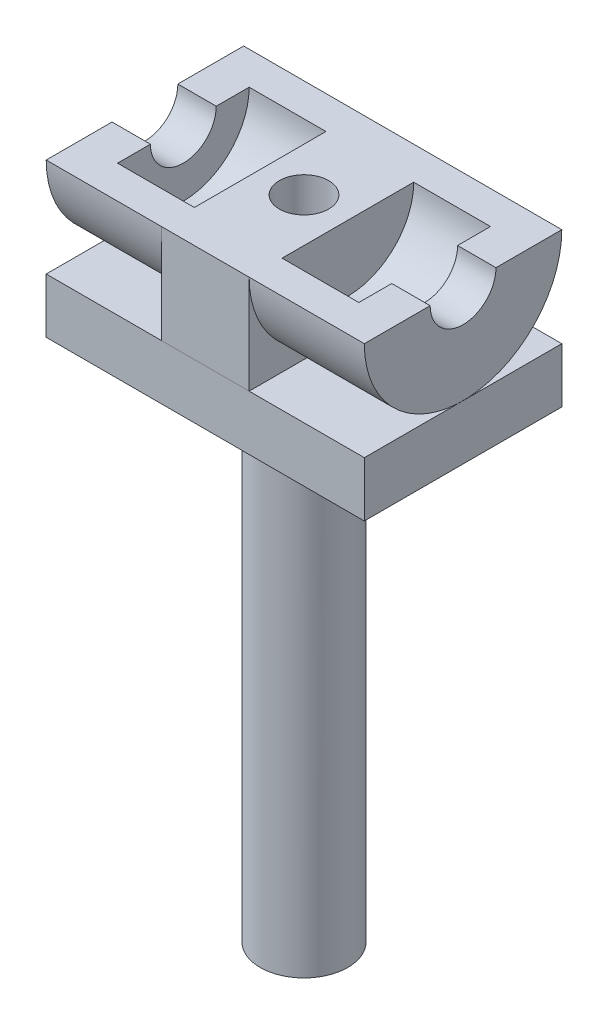
ISO-10303-21;
HEADER;
FILE_DESCRIPTION(('STEP AP214'),'2;1');
FILE_NAME('part.step','',(''),(''),'','','');
FILE_SCHEMA(('AUTOMOTIVE_DESIGN { 1 0 10303 214 1 1 1 1 }'));
ENDSEC;
DATA;
#1=APPLICATION_CONTEXT('core data for automotive mechanical design processes');
#2=APPLICATION_PROTOCOL_DEFINITION('international standard','automotive_design',2000,#1);
#3=PRODUCT_CONTEXT('',#1,'mechanical');
#4=PRODUCT('Part','Part','',(#3));
#5=PRODUCT_RELATED_PRODUCT_CATEGORY('part','',(#4));
#6=PRODUCT_DEFINITION_FORMATION('','',#4);
#7=PRODUCT_DEFINITION_CONTEXT('part definition',#1,'design');
#8=PRODUCT_DEFINITION('design','',#6,#7);
#9=PRODUCT_DEFINITION_SHAPE('','',#8);
#10=(LENGTH_UNIT() NAMED_UNIT(*) SI_UNIT(.MILLI.,.METRE.));
#11=(NAMED_UNIT(*) PLANE_ANGLE_UNIT() SI_UNIT($,.RADIAN.));
#12=(NAMED_UNIT(*) SI_UNIT($,.STERADIAN.) SOLID_ANGLE_UNIT());
#13=UNCERTAINTY_MEASURE_WITH_UNIT(LENGTH_MEASURE(1.E-05),#10,'distance_accuracy_value','');
#14=(GEOMETRIC_REPRESENTATION_CONTEXT(3) GLOBAL_UNCERTAINTY_ASSIGNED_CONTEXT((#13)) GLOBAL_UNIT_ASSIGNED_CONTEXT((#10,
#11,#12)) REPRESENTATION_CONTEXT('',''));
#15=CARTESIAN_POINT('',(0.,0.,0.));
#16=DIRECTION('',(0.,0.,1.));
#17=DIRECTION('',(1.,0.,0.));
#18=AXIS2_PLACEMENT_3D('',#15,#16,#17);
#19=CARTESIAN_POINT('',(0.,-14.,9.));
#20=DIRECTION('',(0.,0.,1.));
#21=DIRECTION('',(1.,0.,0.));
#22=AXIS2_PLACEMENT_3D('',#19,#20,#21);
#23=PLANE('',#22);
#24=DIRECTION('',(1.,0.,0.));
#25=VECTOR('',#24,1.);
#26=CARTESIAN_POINT('',(0.,-9.,9.));
#27=LINE('',#26,#25);
#28=CARTESIAN_POINT('',(-14.5,-9.,9.));
#29=VERTEX_POINT('',#28);
#30=CARTESIAN_POINT('',(14.5,-9.,9.));
#31=VERTEX_POINT('',#30);
#32=EDGE_CURVE('E152',#29,#31,#27,.T.);
#33=ORIENTED_EDGE('',*,*,#32,.F.);
#34=DIRECTION('',(0.,1.,0.));
#35=VECTOR('',#34,1.);
#36=CARTESIAN_POINT('',(-14.5,-14.,9.));
#37=LINE('',#36,#35);
#38=CARTESIAN_POINT('',(-14.5,-14.,9.));
#39=VERTEX_POINT('',#38);
#40=EDGE_CURVE('E13',#39,#29,#37,.T.);
#41=ORIENTED_EDGE('',*,*,#40,.F.);
#42=DIRECTION('',(1.,0.,0.));
#43=VECTOR('',#42,1.);
#44=CARTESIAN_POINT('',(0.,-14.,9.));
#45=LINE('',#44,#43);
#46=CARTESIAN_POINT('',(14.5,-14.,9.));
#47=VERTEX_POINT('',#46);
#48=EDGE_CURVE('E145',#39,#47,#45,.T.);
#49=ORIENTED_EDGE('',*,*,#48,.T.);
#50=DIRECTION('',(0.,1.,0.));
#51=VECTOR('',#50,1.);
#52=CARTESIAN_POINT('',(14.5,-14.,9.));
#53=LINE('',#52,#51);
#54=EDGE_CURVE('E90',#47,#31,#53,.T.);
#55=ORIENTED_EDGE('',*,*,#54,.T.);
#56=EDGE_LOOP('',(#33,#41,#49,#55));
#57=FACE_BOUND('',#56,.T.);
#58=ADVANCED_FACE('F87',(#57),#23,.T.);
#59=CARTESIAN_POINT('',(-14.5,-14.,0.));
#60=DIRECTION('',(-1.,0.,0.));
#61=DIRECTION('',(0.,0.,1.));
#62=AXIS2_PLACEMENT_3D('',#59,#60,#61);
#63=PLANE('',#62);
#64=DIRECTION('',(0.,0.,1.));
#65=VECTOR('',#64,1.);
#66=CARTESIAN_POINT('',(-14.5,-9.,0.));
#67=LINE('',#66,#65);
#68=CARTESIAN_POINT('',(-14.5,-9.,-9.));
#69=VERTEX_POINT('',#68);
#70=EDGE_CURVE('E147',#69,#29,#67,.T.);
#71=ORIENTED_EDGE('',*,*,#70,.F.);
#72=DIRECTION('',(0.,1.,0.));
#73=VECTOR('',#72,1.);
#74=CARTESIAN_POINT('',(-14.5,-14.,-9.));
#75=LINE('',#74,#73);
#76=CARTESIAN_POINT('',(-14.5,-14.,-9.));
#77=VERTEX_POINT('',#76);
#78=EDGE_CURVE('E96',#77,#69,#75,.T.);
#79=ORIENTED_EDGE('',*,*,#78,.F.);
#80=DIRECTION('',(0.,0.,1.));
#81=VECTOR('',#80,1.);
#82=CARTESIAN_POINT('',(-14.5,-14.,0.));
#83=LINE('',#82,#81);
#84=EDGE_CURVE('E142',#77,#39,#83,.T.);
#85=ORIENTED_EDGE('',*,*,#84,.T.);
#86=ORIENTED_EDGE('',*,*,#40,.T.);
#87=EDGE_LOOP('',(#71,#79,#85,#86));
#88=FACE_BOUND('',#87,.T.);
#89=ADVANCED_FACE('F163',(#88),#63,.T.);
#90=CARTESIAN_POINT('',(0.,-14.,-9.));
#91=DIRECTION('',(0.,0.,-1.));
#92=DIRECTION('',(-1.,0.,0.));
#93=AXIS2_PLACEMENT_3D('',#90,#91,#92);
#94=PLANE('',#93);
#95=DIRECTION('',(-1.,0.,0.));
#96=VECTOR('',#95,1.);
#97=CARTESIAN_POINT('',(0.,-9.,-9.));
#98=LINE('',#97,#96);
#99=CARTESIAN_POINT('',(14.5,-9.,-9.));
#100=VERTEX_POINT('',#99);
#101=EDGE_CURVE('E137',#100,#69,#98,.T.);
#102=ORIENTED_EDGE('',*,*,#101,.F.);
#103=DIRECTION('',(0.,1.,0.));
#104=VECTOR('',#103,1.);
#105=CARTESIAN_POINT('',(14.5,-14.,-9.));
#106=LINE('',#105,#104);
#107=CARTESIAN_POINT('',(14.5,-14.,-9.));
#108=VERTEX_POINT('',#107);
#109=EDGE_CURVE('E132',#108,#100,#106,.T.);
#110=ORIENTED_EDGE('',*,*,#109,.F.);
#111=DIRECTION('',(-1.,0.,0.));
#112=VECTOR('',#111,1.);
#113=CARTESIAN_POINT('',(0.,-14.,-9.));
#114=LINE('',#113,#112);
#115=EDGE_CURVE('E135',#108,#77,#114,.T.);
#116=ORIENTED_EDGE('',*,*,#115,.T.);
#117=ORIENTED_EDGE('',*,*,#78,.T.);
#118=EDGE_LOOP('',(#102,#110,#116,#117));
#119=FACE_BOUND('',#118,.T.);
#120=ADVANCED_FACE('F134',(#119),#94,.T.);
#121=CARTESIAN_POINT('',(14.5,-14.,0.));
#122=DIRECTION('',(1.,0.,0.));
#123=DIRECTION('',(0.,0.,-1.));
#124=AXIS2_PLACEMENT_3D('',#121,#122,#123);
#125=PLANE('',#124);
#126=DIRECTION('',(0.,0.,-1.));
#127=VECTOR('',#126,1.);
#128=CARTESIAN_POINT('',(14.5,-9.,0.));
#129=LINE('',#128,#127);
#130=EDGE_CURVE('E155',#31,#100,#129,.T.);
#131=ORIENTED_EDGE('',*,*,#130,.F.);
#132=ORIENTED_EDGE('',*,*,#54,.F.);
#133=DIRECTION('',(0.,0.,-1.));
#134=VECTOR('',#133,1.);
#135=CARTESIAN_POINT('',(14.5,-14.,0.));
#136=LINE('',#135,#134);
#137=EDGE_CURVE('E141',#47,#108,#136,.T.);
#138=ORIENTED_EDGE('',*,*,#137,.T.);
#139=ORIENTED_EDGE('',*,*,#109,.T.);
#140=EDGE_LOOP('',(#131,#132,#138,#139));
#141=FACE_BOUND('',#140,.T.);
#142=ADVANCED_FACE('F144',(#141),#125,.T.);
#143=CARTESIAN_POINT('',(0.,-14.,0.));
#144=DIRECTION('',(0.,1.,0.));
#145=DIRECTION('',(0.,0.,1.));
#146=AXIS2_PLACEMENT_3D('',#143,#144,#145);
#147=PLANE('',#146);
#148=CARTESIAN_POINT('',(0.,-14.,0.));
#149=DIRECTION('',(0.,1.,0.));
#150=DIRECTION('',(0.,0.,1.));
#151=AXIS2_PLACEMENT_3D('',#148,#149,#150);
#152=CIRCLE('',#151,3.5);
#153=CARTESIAN_POINT('',(0.,-14.,3.5));
#154=VERTEX_POINT('',#153);
#155=EDGE_CURVE('E156',#154,#154,#152,.T.);
#156=ORIENTED_EDGE('',*,*,#155,.T.);
#157=EDGE_LOOP('',(#156));
#158=FACE_BOUND('',#157,.T.);
#159=ORIENTED_EDGE('',*,*,#48,.F.);
#160=ORIENTED_EDGE('',*,*,#84,.F.);
#161=ORIENTED_EDGE('',*,*,#115,.F.);
#162=ORIENTED_EDGE('',*,*,#137,.F.);
#163=EDGE_LOOP('',(#159,#160,#161,#162));
#164=FACE_BOUND('',#163,.T.);
#165=ADVANCED_FACE('F140',(#158,#164),#147,.F.);
#166=CARTESIAN_POINT('',(0.,-9.,0.));
#167=DIRECTION('',(0.,1.,0.));
#168=DIRECTION('',(0.,0.,1.));
#169=AXIS2_PLACEMENT_3D('',#166,#167,#168);
#170=PLANE('',#169);
#171=CARTESIAN_POINT('',(0.,-9.,0.));
#172=DIRECTION('',(0.,1.,0.));
#173=DIRECTION('',(0.,0.,1.));
#174=AXIS2_PLACEMENT_3D('',#171,#172,#173);
#175=CIRCLE('',#174,3.5);
#176=CARTESIAN_POINT('',(0.,-9.,3.5));
#177=VERTEX_POINT('',#176);
#178=EDGE_CURVE('E193',#177,#177,#175,.T.);
#179=ORIENTED_EDGE('',*,*,#178,.F.);
#180=EDGE_LOOP('',(#179));
#181=FACE_BOUND('',#180,.T.);
#182=ORIENTED_EDGE('',*,*,#32,.T.);
#183=ORIENTED_EDGE('',*,*,#130,.T.);
#184=ORIENTED_EDGE('',*,*,#101,.T.);
#185=ORIENTED_EDGE('',*,*,#70,.T.);
#186=EDGE_LOOP('',(#182,#183,#184,#185));
#187=FACE_BOUND('',#186,.T.);
#188=ADVANCED_FACE('F162',(#181,#187),#170,.T.);
#189=CARTESIAN_POINT('',(0.,-14.,0.));
#190=DIRECTION('',(0.,1.,0.));
#191=DIRECTION('',(0.,0.,1.));
#192=AXIS2_PLACEMENT_3D('',#189,#190,#191);
#193=CYLINDRICAL_SURFACE('',#192,3.5);
#194=ORIENTED_EDGE('',*,*,#155,.F.);
#195=EDGE_LOOP('',(#194));
#196=FACE_BOUND('',#195,.T.);
#197=ORIENTED_EDGE('',*,*,#178,.T.);
#198=EDGE_LOOP('',(#197));
#199=FACE_BOUND('',#198,.T.);
#200=ADVANCED_FACE('F181',(#196,#199),#193,.F.);
#201=CLOSED_SHELL('',(#58,#89,#120,#142,#165,#188,#200));
#202=MANIFOLD_SOLID_BREP('B2',#201);
#203=CARTESIAN_POINT('',(0.,-9.,0.));
#204=DIRECTION('',(0.,1.,0.));
#205=DIRECTION('',(0.,0.,1.));
#206=AXIS2_PLACEMENT_3D('',#203,#204,#205);
#207=PLANE('',#206);
#208=CARTESIAN_POINT('',(0.,-9.,0.));
#209=DIRECTION('',(0.,1.,0.));
#210=DIRECTION('',(0.,0.,1.));
#211=AXIS2_PLACEMENT_3D('',#208,#209,#210);
#212=CIRCLE('',#211,2.25);
#213=CARTESIAN_POINT('',(0.,-9.,2.25));
#214=VERTEX_POINT('',#213);
#215=EDGE_CURVE('E467',#214,#214,#212,.T.);
#216=ORIENTED_EDGE('',*,*,#215,.T.);
#217=EDGE_LOOP('',(#216));
#218=FACE_BOUND('',#217,.T.);
#219=CARTESIAN_POINT('',(0.,-9.,0.));
#220=DIRECTION('',(0.,-1.,0.));
#221=DIRECTION('',(0.,0.,-1.));
#222=AXIS2_PLACEMENT_3D('',#219,#220,#221);
#223=CIRCLE('',#222,2.6);
#224=CARTESIAN_POINT('',(0.,-9.,-2.6));
#225=VERTEX_POINT('',#224);
#226=EDGE_CURVE('E403',#225,#225,#223,.T.);
#227=ORIENTED_EDGE('',*,*,#226,.T.);
#228=EDGE_LOOP('',(#227));
#229=FACE_BOUND('',#228,.T.);
#230=ADVANCED_FACE('F246',(#218,#229),#207,.F.);
#231=CARTESIAN_POINT('',(0.,-9.,0.));
#232=DIRECTION('',(0.,-1.,0.));
#233=DIRECTION('',(0.,0.,-1.));
#234=AXIS2_PLACEMENT_3D('',#231,#232,#233);
#235=CIRCLE('',#234,4.);
#236=CARTESIAN_POINT('',(-4.,-9.,0.));
#237=VERTEX_POINT('',#236);
#238=CARTESIAN_POINT('',(4.,-9.,0.));
#239=VERTEX_POINT('',#238);
#240=EDGE_CURVE('E397',#237,#239,#235,.T.);
#241=ORIENTED_EDGE('',*,*,#240,.F.);
#242=DIRECTION('',(0.,0.,1.));
#243=VECTOR('',#242,1.);
#244=CARTESIAN_POINT('',(-4.,-9.,-9.));
#245=LINE('',#244,#243);
#246=CARTESIAN_POINT('',(-4.,-9.,-9.));
#247=VERTEX_POINT('',#246);
#248=EDGE_CURVE('E366',#247,#237,#245,.T.);
#249=ORIENTED_EDGE('',*,*,#248,.F.);
#250=DIRECTION('',(-1.,0.,0.));
#251=VECTOR('',#250,1.);
#252=CARTESIAN_POINT('',(-4.,-9.,-9.));
#253=LINE('',#252,#251);
#254=CARTESIAN_POINT('',(4.,-9.,-9.));
#255=VERTEX_POINT('',#254);
#256=EDGE_CURVE('E389',#255,#247,#253,.T.);
#257=ORIENTED_EDGE('',*,*,#256,.F.);
#258=DIRECTION('',(0.,0.,-1.));
#259=VECTOR('',#258,1.);
#260=CARTESIAN_POINT('',(4.,-9.,-9.));
#261=LINE('',#260,#259);
#262=EDGE_CURVE('E399',#239,#255,#261,.T.);
#263=ORIENTED_EDGE('',*,*,#262,.F.);
#264=EDGE_LOOP('',(#241,#249,#257,#263));
#265=FACE_BOUND('',#264,.T.);
#266=ADVANCED_FACE('F398',(#265),#207,.F.);
#267=CARTESIAN_POINT('',(-39.0878378378379,0.,0.));
#268=DIRECTION('',(-1.,0.,0.));
#269=DIRECTION('',(0.,0.,1.));
#270=AXIS2_PLACEMENT_3D('',#267,#268,#269);
#271=CYLINDRICAL_SURFACE('',#270,6.);
#272=DIRECTION('',(-1.,0.,0.));
#273=VECTOR('',#272,1.);
#274=CARTESIAN_POINT('',(-39.0878378378379,0.,-6.));
#275=LINE('',#274,#273);
#276=CARTESIAN_POINT('',(-11.,0.,-6.));
#277=VERTEX_POINT('',#276);
#278=CARTESIAN_POINT('',(-4.,0.,-6.));
#279=VERTEX_POINT('',#278);
#280=EDGE_CURVE('E427',#277,#279,#275,.F.);
#281=ORIENTED_EDGE('',*,*,#280,.F.);
#282=CARTESIAN_POINT('',(-11.,0.,0.));
#283=DIRECTION('',(-1.,0.,0.));
#284=DIRECTION('',(0.,0.,1.));
#285=AXIS2_PLACEMENT_3D('',#282,#283,#284);
#286=CIRCLE('',#285,6.);
#287=CARTESIAN_POINT('',(-11.,0.,6.));
#288=VERTEX_POINT('',#287);
#289=EDGE_CURVE('E534',#277,#288,#286,.T.);
#290=ORIENTED_EDGE('',*,*,#289,.T.);
#291=DIRECTION('',(-1.,0.,0.));
#292=VECTOR('',#291,1.);
#293=CARTESIAN_POINT('',(-39.0878378378379,0.,6.));
#294=LINE('',#293,#292);
#295=CARTESIAN_POINT('',(-4.,0.,6.));
#296=VERTEX_POINT('',#295);
#297=EDGE_CURVE('E415',#296,#288,#294,.T.);
#298=ORIENTED_EDGE('',*,*,#297,.F.);
#299=CARTESIAN_POINT('',(-4.,0.,0.));
#300=DIRECTION('',(-1.,0.,0.));
#301=DIRECTION('',(0.,0.,1.));
#302=AXIS2_PLACEMENT_3D('',#299,#300,#301);
#303=CIRCLE('',#302,6.);
#304=EDGE_CURVE('E501',#296,#279,#303,.F.);
#305=ORIENTED_EDGE('',*,*,#304,.T.);
#306=EDGE_LOOP('',(#281,#290,#298,#305));
#307=FACE_BOUND('',#306,.T.);
#308=ADVANCED_FACE('F554',(#307),#271,.F.);
#309=CARTESIAN_POINT('',(4.,0.,-6.));
#310=VERTEX_POINT('',#309);
#311=CARTESIAN_POINT('',(11.,0.,-6.));
#312=VERTEX_POINT('',#311);
#313=EDGE_CURVE('E421',#310,#312,#275,.F.);
#314=ORIENTED_EDGE('',*,*,#313,.F.);
#315=CARTESIAN_POINT('',(4.,0.,0.));
#316=DIRECTION('',(1.,0.,0.));
#317=DIRECTION('',(0.,0.,-1.));
#318=AXIS2_PLACEMENT_3D('',#315,#316,#317);
#319=CIRCLE('',#318,6.);
#320=CARTESIAN_POINT('',(4.,0.,6.));
#321=VERTEX_POINT('',#320);
#322=EDGE_CURVE('E511',#310,#321,#319,.F.);
#323=ORIENTED_EDGE('',*,*,#322,.T.);
#324=CARTESIAN_POINT('',(11.,0.,6.));
#325=VERTEX_POINT('',#324);
#326=EDGE_CURVE('E420',#325,#321,#294,.T.);
#327=ORIENTED_EDGE('',*,*,#326,.F.);
#328=CARTESIAN_POINT('',(11.,0.,0.));
#329=DIRECTION('',(-1.,0.,0.));
#330=DIRECTION('',(0.,0.,1.));
#331=AXIS2_PLACEMENT_3D('',#328,#329,#330);
#332=CIRCLE('',#331,6.);
#333=EDGE_CURVE('E530',#312,#325,#332,.T.);
#334=ORIENTED_EDGE('',*,*,#333,.F.);
#335=EDGE_LOOP('',(#314,#323,#327,#334));
#336=FACE_BOUND('',#335,.T.);
#337=ADVANCED_FACE('F746',(#336),#271,.F.);
#338=CARTESIAN_POINT('',(-39.0878378378379,0.,0.));
#339=DIRECTION('',(-1.,0.,0.));
#340=DIRECTION('',(0.,0.,1.));
#341=AXIS2_PLACEMENT_3D('',#338,#339,#340);
#342=CYLINDRICAL_SURFACE('',#341,9.);
#343=DIRECTION('',(-1.,0.,0.));
#344=VECTOR('',#343,1.);
#345=CARTESIAN_POINT('',(-39.0878378378379,0.,-9.));
#346=LINE('',#345,#344);
#347=CARTESIAN_POINT('',(14.5,0.,-9.));
#348=VERTEX_POINT('',#347);
#349=CARTESIAN_POINT('',(4.,0.,-9.));
#350=VERTEX_POINT('',#349);
#351=EDGE_CURVE('E426',#348,#350,#346,.T.);
#352=ORIENTED_EDGE('',*,*,#351,.F.);
#353=CARTESIAN_POINT('',(14.5,0.,0.));
#354=DIRECTION('',(-1.,0.,0.));
#355=DIRECTION('',(0.,0.,1.));
#356=AXIS2_PLACEMENT_3D('',#353,#354,#355);
#357=CIRCLE('',#356,9.);
#358=CARTESIAN_POINT('',(14.5,0.,9.));
#359=VERTEX_POINT('',#358);
#360=EDGE_CURVE('E518',#348,#359,#357,.T.);
#361=ORIENTED_EDGE('',*,*,#360,.T.);
#362=DIRECTION('',(-1.,0.,0.));
#363=VECTOR('',#362,1.);
#364=CARTESIAN_POINT('',(-39.0878378378379,0.,9.));
#365=LINE('',#364,#363);
#366=CARTESIAN_POINT('',(4.,0.,9.));
#367=VERTEX_POINT('',#366);
#368=EDGE_CURVE('E442',#367,#359,#365,.F.);
#369=ORIENTED_EDGE('',*,*,#368,.F.);
#370=CARTESIAN_POINT('',(4.,0.,0.));
#371=DIRECTION('',(1.,0.,0.));
#372=DIRECTION('',(0.,0.,-1.));
#373=AXIS2_PLACEMENT_3D('',#370,#371,#372);
#374=CIRCLE('',#373,9.);
#375=EDGE_CURVE('E85',#367,#239,#374,.T.);
#376=ORIENTED_EDGE('',*,*,#375,.T.);
#377=EDGE_CURVE('E250',#239,#350,#374,.T.);
#378=ORIENTED_EDGE('',*,*,#377,.T.);
#379=EDGE_LOOP('',(#352,#361,#369,#376,#378));
#380=FACE_BOUND('',#379,.T.);
#381=ADVANCED_FACE('F621',(#380),#342,.T.);
#382=CARTESIAN_POINT('',(-4.,0.,-9.));
#383=VERTEX_POINT('',#382);
#384=CARTESIAN_POINT('',(-14.5,0.,-9.));
#385=VERTEX_POINT('',#384);
#386=EDGE_CURVE('E361',#383,#385,#346,.T.);
#387=ORIENTED_EDGE('',*,*,#386,.F.);
#388=CARTESIAN_POINT('',(-4.,0.,0.));
#389=DIRECTION('',(-1.,0.,0.));
#390=DIRECTION('',(0.,0.,1.));
#391=AXIS2_PLACEMENT_3D('',#388,#389,#390);
#392=CIRCLE('',#391,9.);
#393=EDGE_CURVE('E355',#383,#237,#392,.T.);
#394=ORIENTED_EDGE('',*,*,#393,.T.);
#395=CARTESIAN_POINT('',(-4.,0.,9.));
#396=VERTEX_POINT('',#395);
#397=EDGE_CURVE('E359',#237,#396,#392,.T.);
#398=ORIENTED_EDGE('',*,*,#397,.T.);
#399=CARTESIAN_POINT('',(-14.5,0.,9.));
#400=VERTEX_POINT('',#399);
#401=EDGE_CURVE('E269',#400,#396,#365,.F.);
#402=ORIENTED_EDGE('',*,*,#401,.F.);
#403=CARTESIAN_POINT('',(-14.5,0.,0.));
#404=DIRECTION('',(-1.,0.,0.));
#405=DIRECTION('',(0.,0.,1.));
#406=AXIS2_PLACEMENT_3D('',#403,#404,#405);
#407=CIRCLE('',#406,9.);
#408=EDGE_CURVE('E515',#385,#400,#407,.T.);
#409=ORIENTED_EDGE('',*,*,#408,.F.);
#410=EDGE_LOOP('',(#387,#394,#398,#402,#409));
#411=FACE_BOUND('',#410,.T.);
#412=ADVANCED_FACE('F357',(#411),#342,.T.);
#413=CARTESIAN_POINT('',(-14.5,9.,0.));
#414=DIRECTION('',(1.,0.,0.));
#415=DIRECTION('',(0.,0.,-1.));
#416=AXIS2_PLACEMENT_3D('',#413,#414,#415);
#417=PLANE('',#416);
#418=DIRECTION('',(0.,0.,1.));
#419=VECTOR('',#418,1.);
#420=CARTESIAN_POINT('',(-14.5,0.,0.));
#421=LINE('',#420,#419);
#422=CARTESIAN_POINT('',(-14.5,0.,-3.));
#423=VERTEX_POINT('',#422);
#424=EDGE_CURVE('E262',#385,#423,#421,.T.);
#425=ORIENTED_EDGE('',*,*,#424,.F.);
#426=ORIENTED_EDGE('',*,*,#408,.T.);
#427=CARTESIAN_POINT('',(-14.5,0.,3.));
#428=VERTEX_POINT('',#427);
#429=EDGE_CURVE('E436',#428,#400,#421,.T.);
#430=ORIENTED_EDGE('',*,*,#429,.F.);
#431=CARTESIAN_POINT('',(-14.5,0.,0.));
#432=DIRECTION('',(-1.,0.,0.));
#433=DIRECTION('',(0.,0.,1.));
#434=AXIS2_PLACEMENT_3D('',#431,#432,#433);
#435=CIRCLE('',#434,3.);
#436=EDGE_CURVE('E394',#423,#428,#435,.T.);
#437=ORIENTED_EDGE('',*,*,#436,.F.);
#438=EDGE_LOOP('',(#425,#426,#430,#437));
#439=FACE_BOUND('',#438,.T.);
#440=ADVANCED_FACE('F248',(#439),#417,.F.);
#441=CARTESIAN_POINT('',(-39.0878378378379,0.,0.));
#442=DIRECTION('',(-1.,0.,0.));
#443=DIRECTION('',(0.,0.,1.));
#444=AXIS2_PLACEMENT_3D('',#441,#442,#443);
#445=CYLINDRICAL_SURFACE('',#444,3.);
#446=DIRECTION('',(-1.,0.,0.));
#447=VECTOR('',#446,1.);
#448=CARTESIAN_POINT('',(-39.0878378378379,0.,-3.));
#449=LINE('',#448,#447);
#450=CARTESIAN_POINT('',(-11.,0.,-3.));
#451=VERTEX_POINT('',#450);
#452=EDGE_CURVE('E459',#423,#451,#449,.F.);
#453=ORIENTED_EDGE('',*,*,#452,.F.);
#454=ORIENTED_EDGE('',*,*,#436,.T.);
#455=DIRECTION('',(-1.,0.,0.));
#456=VECTOR('',#455,1.);
#457=CARTESIAN_POINT('',(-39.0878378378379,0.,3.));
#458=LINE('',#457,#456);
#459=CARTESIAN_POINT('',(-11.,0.,3.));
#460=VERTEX_POINT('',#459);
#461=EDGE_CURVE('E431',#460,#428,#458,.T.);
#462=ORIENTED_EDGE('',*,*,#461,.F.);
#463=CARTESIAN_POINT('',(-11.,0.,0.));
#464=DIRECTION('',(-1.,0.,0.));
#465=DIRECTION('',(0.,0.,1.));
#466=AXIS2_PLACEMENT_3D('',#463,#464,#465);
#467=CIRCLE('',#466,3.);
#468=EDGE_CURVE('E538',#451,#460,#467,.T.);
#469=ORIENTED_EDGE('',*,*,#468,.F.);
#470=EDGE_LOOP('',(#453,#454,#462,#469));
#471=FACE_BOUND('',#470,.T.);
#472=ADVANCED_FACE('F545',(#471),#445,.F.);
#473=CARTESIAN_POINT('',(-11.,3.,0.));
#474=DIRECTION('',(-1.,0.,0.));
#475=DIRECTION('',(0.,0.,1.));
#476=AXIS2_PLACEMENT_3D('',#473,#474,#475);
#477=PLANE('',#476);
#478=DIRECTION('',(0.,0.,-1.));
#479=VECTOR('',#478,1.);
#480=CARTESIAN_POINT('',(-11.,0.,0.));
#481=LINE('',#480,#479);
#482=EDGE_CURVE('E419',#288,#460,#481,.T.);
#483=ORIENTED_EDGE('',*,*,#482,.F.);
#484=ORIENTED_EDGE('',*,*,#289,.F.);
#485=EDGE_CURVE('E432',#451,#277,#481,.T.);
#486=ORIENTED_EDGE('',*,*,#485,.F.);
#487=ORIENTED_EDGE('',*,*,#468,.T.);
#488=EDGE_LOOP('',(#483,#484,#486,#487));
#489=FACE_BOUND('',#488,.T.);
#490=ADVANCED_FACE('F551',(#489),#477,.F.);
#491=CARTESIAN_POINT('',(11.,3.,0.));
#492=DIRECTION('',(1.,0.,0.));
#493=DIRECTION('',(0.,0.,-1.));
#494=AXIS2_PLACEMENT_3D('',#491,#492,#493);
#495=PLANE('',#494);
#496=DIRECTION('',(0.,0.,1.));
#497=VECTOR('',#496,1.);
#498=CARTESIAN_POINT('',(11.,0.,0.));
#499=LINE('',#498,#497);
#500=CARTESIAN_POINT('',(11.,0.,-3.));
#501=VERTEX_POINT('',#500);
#502=EDGE_CURVE('E456',#312,#501,#499,.T.);
#503=ORIENTED_EDGE('',*,*,#502,.F.);
#504=ORIENTED_EDGE('',*,*,#333,.T.);
#505=CARTESIAN_POINT('',(11.,0.,3.));
#506=VERTEX_POINT('',#505);
#507=EDGE_CURVE('E452',#506,#325,#499,.T.);
#508=ORIENTED_EDGE('',*,*,#507,.F.);
#509=CARTESIAN_POINT('',(11.,0.,0.));
#510=DIRECTION('',(-1.,0.,0.));
#511=DIRECTION('',(0.,0.,1.));
#512=AXIS2_PLACEMENT_3D('',#509,#510,#511);
#513=CIRCLE('',#512,3.);
#514=EDGE_CURVE('E526',#501,#506,#513,.T.);
#515=ORIENTED_EDGE('',*,*,#514,.F.);
#516=EDGE_LOOP('',(#503,#504,#508,#515));
#517=FACE_BOUND('',#516,.T.);
#518=ADVANCED_FACE('F701',(#517),#495,.F.);
#519=CARTESIAN_POINT('',(-39.0878378378379,0.,0.));
#520=DIRECTION('',(-1.,0.,0.));
#521=DIRECTION('',(0.,0.,1.));
#522=AXIS2_PLACEMENT_3D('',#519,#520,#521);
#523=CYLINDRICAL_SURFACE('',#522,3.);
#524=DIRECTION('',(-1.,0.,0.));
#525=VECTOR('',#524,1.);
#526=CARTESIAN_POINT('',(-39.0878378378379,0.,-3.));
#527=LINE('',#526,#525);
#528=CARTESIAN_POINT('',(14.5,0.,-3.));
#529=VERTEX_POINT('',#528);
#530=EDGE_CURVE('E463',#501,#529,#527,.F.);
#531=ORIENTED_EDGE('',*,*,#530,.F.);
#532=ORIENTED_EDGE('',*,*,#514,.T.);
#533=DIRECTION('',(-1.,0.,0.));
#534=VECTOR('',#533,1.);
#535=CARTESIAN_POINT('',(-39.0878378378379,0.,3.));
#536=LINE('',#535,#534);
#537=CARTESIAN_POINT('',(14.5,0.,3.));
#538=VERTEX_POINT('',#537);
#539=EDGE_CURVE('E447',#538,#506,#536,.T.);
#540=ORIENTED_EDGE('',*,*,#539,.F.);
#541=CARTESIAN_POINT('',(14.5,0.,0.));
#542=DIRECTION('',(-1.,0.,0.));
#543=DIRECTION('',(0.,0.,1.));
#544=AXIS2_PLACEMENT_3D('',#541,#542,#543);
#545=CIRCLE('',#544,3.);
#546=EDGE_CURVE('E522',#529,#538,#545,.T.);
#547=ORIENTED_EDGE('',*,*,#546,.F.);
#548=EDGE_LOOP('',(#531,#532,#540,#547));
#549=FACE_BOUND('',#548,.T.);
#550=ADVANCED_FACE('F627',(#549),#523,.F.);
#551=CARTESIAN_POINT('',(14.5,9.,0.));
#552=DIRECTION('',(-1.,0.,0.));
#553=DIRECTION('',(0.,0.,1.));
#554=AXIS2_PLACEMENT_3D('',#551,#552,#553);
#555=PLANE('',#554);
#556=DIRECTION('',(0.,0.,-1.));
#557=VECTOR('',#556,1.);
#558=CARTESIAN_POINT('',(14.5,0.,0.));
#559=LINE('',#558,#557);
#560=EDGE_CURVE('E443',#359,#538,#559,.T.);
#561=ORIENTED_EDGE('',*,*,#560,.F.);
#562=ORIENTED_EDGE('',*,*,#360,.F.);
#563=EDGE_CURVE('E448',#529,#348,#559,.T.);
#564=ORIENTED_EDGE('',*,*,#563,.F.);
#565=ORIENTED_EDGE('',*,*,#546,.T.);
#566=EDGE_LOOP('',(#561,#562,#564,#565));
#567=FACE_BOUND('',#566,.T.);
#568=ADVANCED_FACE('F624',(#567),#555,.F.);
#569=CARTESIAN_POINT('',(-4.,-9.,-9.));
#570=DIRECTION('',(0.,0.,-1.));
#571=DIRECTION('',(-1.,0.,0.));
#572=AXIS2_PLACEMENT_3D('',#569,#570,#571);
#573=PLANE('',#572);
#574=DIRECTION('',(-1.,0.,0.));
#575=VECTOR('',#574,1.);
#576=CARTESIAN_POINT('',(-4.,0.,-9.));
#577=LINE('',#576,#575);
#578=EDGE_CURVE('E486',#350,#383,#577,.T.);
#579=ORIENTED_EDGE('',*,*,#578,.F.);
#580=DIRECTION('',(0.,1.,0.));
#581=VECTOR('',#580,1.);
#582=CARTESIAN_POINT('',(4.,-9.,-9.));
#583=LINE('',#582,#581);
#584=EDGE_CURVE('E482',#255,#350,#583,.T.);
#585=ORIENTED_EDGE('',*,*,#584,.F.);
#586=ORIENTED_EDGE('',*,*,#256,.T.);
#587=DIRECTION('',(0.,1.,0.));
#588=VECTOR('',#587,1.);
#589=CARTESIAN_POINT('',(-4.,-9.,-9.));
#590=LINE('',#589,#588);
#591=EDGE_CURVE('E369',#247,#383,#590,.T.);
#592=ORIENTED_EDGE('',*,*,#591,.T.);
#593=EDGE_LOOP('',(#579,#585,#586,#592));
#594=FACE_BOUND('',#593,.T.);
#595=ADVANCED_FACE('F639',(#594),#573,.T.);
#596=CARTESIAN_POINT('',(-4.,-9.,-9.));
#597=DIRECTION('',(-1.,0.,0.));
#598=DIRECTION('',(0.,0.,1.));
#599=AXIS2_PLACEMENT_3D('',#596,#597,#598);
#600=PLANE('',#599);
#601=ORIENTED_EDGE('',*,*,#397,.F.);
#602=CARTESIAN_POINT('',(-4.,-9.,9.));
#603=VERTEX_POINT('',#602);
#604=EDGE_CURVE('E376',#237,#603,#245,.T.);
#605=ORIENTED_EDGE('',*,*,#604,.T.);
#606=DIRECTION('',(0.,1.,0.));
#607=VECTOR('',#606,1.);
#608=CARTESIAN_POINT('',(-4.,-9.,9.));
#609=LINE('',#608,#607);
#610=EDGE_CURVE('E391',#603,#396,#609,.T.);
#611=ORIENTED_EDGE('',*,*,#610,.T.);
#612=EDGE_LOOP('',(#601,#605,#611));
#613=FACE_BOUND('',#612,.T.);
#614=ADVANCED_FACE('F390',(#613),#600,.T.);
#615=CARTESIAN_POINT('',(-4.,-9.,9.));
#616=DIRECTION('',(0.,0.,1.));
#617=DIRECTION('',(1.,0.,0.));
#618=AXIS2_PLACEMENT_3D('',#615,#616,#617);
#619=PLANE('',#618);
#620=DIRECTION('',(1.,0.,0.));
#621=VECTOR('',#620,1.);
#622=CARTESIAN_POINT('',(-4.,0.,9.));
#623=LINE('',#622,#621);
#624=EDGE_CURVE('E493',#396,#367,#623,.T.);
#625=ORIENTED_EDGE('',*,*,#624,.F.);
#626=ORIENTED_EDGE('',*,*,#610,.F.);
#627=DIRECTION('',(1.,0.,0.));
#628=VECTOR('',#627,1.);
#629=CARTESIAN_POINT('',(-4.,-9.,9.));
#630=LINE('',#629,#628);
#631=CARTESIAN_POINT('',(4.,-9.,9.));
#632=VERTEX_POINT('',#631);
#633=EDGE_CURVE('E375',#603,#632,#630,.T.);
#634=ORIENTED_EDGE('',*,*,#633,.T.);
#635=DIRECTION('',(0.,1.,0.));
#636=VECTOR('',#635,1.);
#637=CARTESIAN_POINT('',(4.,-9.,9.));
#638=LINE('',#637,#636);
#639=EDGE_CURVE('E497',#632,#367,#638,.T.);
#640=ORIENTED_EDGE('',*,*,#639,.T.);
#641=EDGE_LOOP('',(#625,#626,#634,#640));
#642=FACE_BOUND('',#641,.T.);
#643=ADVANCED_FACE('F601',(#642),#619,.T.);
#644=CARTESIAN_POINT('',(4.,-9.,-9.));
#645=DIRECTION('',(1.,0.,0.));
#646=DIRECTION('',(0.,0.,-1.));
#647=AXIS2_PLACEMENT_3D('',#644,#645,#646);
#648=PLANE('',#647);
#649=ORIENTED_EDGE('',*,*,#377,.F.);
#650=ORIENTED_EDGE('',*,*,#262,.T.);
#651=ORIENTED_EDGE('',*,*,#584,.T.);
#652=EDGE_LOOP('',(#649,#650,#651));
#653=FACE_BOUND('',#652,.T.);
#654=ADVANCED_FACE('F593',(#653),#648,.T.);
#655=EDGE_CURVE('E383',#239,#237,#235,.T.);
#656=ORIENTED_EDGE('',*,*,#655,.F.);
#657=EDGE_CURVE('E475',#632,#239,#261,.T.);
#658=ORIENTED_EDGE('',*,*,#657,.F.);
#659=ORIENTED_EDGE('',*,*,#633,.F.);
#660=ORIENTED_EDGE('',*,*,#604,.F.);
#661=EDGE_LOOP('',(#656,#658,#659,#660));
#662=FACE_BOUND('',#661,.T.);
#663=ADVANCED_FACE('F380',(#662),#207,.F.);
#664=ORIENTED_EDGE('',*,*,#393,.F.);
#665=ORIENTED_EDGE('',*,*,#591,.F.);
#666=ORIENTED_EDGE('',*,*,#248,.T.);
#667=EDGE_LOOP('',(#664,#665,#666));
#668=FACE_BOUND('',#667,.T.);
#669=ADVANCED_FACE('F368',(#668),#600,.T.);
#670=ORIENTED_EDGE('',*,*,#375,.F.);
#671=ORIENTED_EDGE('',*,*,#639,.F.);
#672=ORIENTED_EDGE('',*,*,#657,.T.);
#673=EDGE_LOOP('',(#670,#671,#672));
#674=FACE_BOUND('',#673,.T.);
#675=ADVANCED_FACE('F598',(#674),#648,.T.);
#676=ORIENTED_EDGE('',*,*,#322,.F.);
#677=DIRECTION('',(0.,0.,-1.));
#678=VECTOR('',#677,1.);
#679=CARTESIAN_POINT('',(4.,0.,-9.));
#680=LINE('',#679,#678);
#681=EDGE_CURVE('E471',#321,#310,#680,.T.);
#682=ORIENTED_EDGE('',*,*,#681,.F.);
#683=EDGE_LOOP('',(#676,#682));
#684=FACE_BOUND('',#683,.T.);
#685=ADVANCED_FACE('F604',(#684),#648,.T.);
#686=ORIENTED_EDGE('',*,*,#304,.F.);
#687=DIRECTION('',(0.,0.,1.));
#688=VECTOR('',#687,1.);
#689=CARTESIAN_POINT('',(-4.,0.,-9.));
#690=LINE('',#689,#688);
#691=EDGE_CURVE('E489',#279,#296,#690,.T.);
#692=ORIENTED_EDGE('',*,*,#691,.F.);
#693=EDGE_LOOP('',(#686,#692));
#694=FACE_BOUND('',#693,.T.);
#695=ADVANCED_FACE('F600',(#694),#600,.T.);
#696=CARTESIAN_POINT('',(0.,0.,0.));
#697=DIRECTION('',(0.,1.,0.));
#698=DIRECTION('',(0.,0.,1.));
#699=AXIS2_PLACEMENT_3D('',#696,#697,#698);
#700=PLANE('',#699);
#701=CARTESIAN_POINT('',(0.,0.,0.));
#702=DIRECTION('',(0.,1.,0.));
#703=DIRECTION('',(0.,0.,1.));
#704=AXIS2_PLACEMENT_3D('',#701,#702,#703);
#705=CIRCLE('',#704,2.25);
#706=CARTESIAN_POINT('',(0.,0.,2.25));
#707=VERTEX_POINT('',#706);
#708=EDGE_CURVE('E425',#707,#707,#705,.T.);
#709=ORIENTED_EDGE('',*,*,#708,.F.);
#710=EDGE_LOOP('',(#709));
#711=FACE_BOUND('',#710,.T.);
#712=ORIENTED_EDGE('',*,*,#681,.T.);
#713=ORIENTED_EDGE('',*,*,#313,.T.);
#714=ORIENTED_EDGE('',*,*,#502,.T.);
#715=ORIENTED_EDGE('',*,*,#530,.T.);
#716=ORIENTED_EDGE('',*,*,#563,.T.);
#717=ORIENTED_EDGE('',*,*,#351,.T.);
#718=ORIENTED_EDGE('',*,*,#578,.T.);
#719=ORIENTED_EDGE('',*,*,#386,.T.);
#720=ORIENTED_EDGE('',*,*,#424,.T.);
#721=ORIENTED_EDGE('',*,*,#452,.T.);
#722=ORIENTED_EDGE('',*,*,#485,.T.);
#723=ORIENTED_EDGE('',*,*,#280,.T.);
#724=ORIENTED_EDGE('',*,*,#691,.T.);
#725=ORIENTED_EDGE('',*,*,#297,.T.);
#726=ORIENTED_EDGE('',*,*,#482,.T.);
#727=ORIENTED_EDGE('',*,*,#461,.T.);
#728=ORIENTED_EDGE('',*,*,#429,.T.);
#729=ORIENTED_EDGE('',*,*,#401,.T.);
#730=ORIENTED_EDGE('',*,*,#624,.T.);
#731=ORIENTED_EDGE('',*,*,#368,.T.);
#732=ORIENTED_EDGE('',*,*,#560,.T.);
#733=ORIENTED_EDGE('',*,*,#539,.T.);
#734=ORIENTED_EDGE('',*,*,#507,.T.);
#735=ORIENTED_EDGE('',*,*,#326,.T.);
#736=EDGE_LOOP('',(#712,#713,#714,#715,#716,#717,#718,#719,#720,#721,#722,#723,#724,#725,#726,
#727,#728,#729,#730,#731,#732,#733,#734,#735));
#737=FACE_BOUND('',#736,.T.);
#738=ADVANCED_FACE('F548',(#711,#737),#700,.T.);
#739=CARTESIAN_POINT('',(0.,10.,0.));
#740=DIRECTION('',(0.,-1.,0.));
#741=DIRECTION('',(0.,0.,-1.));
#742=AXIS2_PLACEMENT_3D('',#739,#740,#741);
#743=CYLINDRICAL_SURFACE('',#742,2.25);
#744=ORIENTED_EDGE('',*,*,#215,.F.);
#745=EDGE_LOOP('',(#744));
#746=FACE_BOUND('',#745,.T.);
#747=ORIENTED_EDGE('',*,*,#708,.T.);
#748=EDGE_LOOP('',(#747));
#749=FACE_BOUND('',#748,.T.);
#750=ADVANCED_FACE('F581',(#746,#749),#743,.F.);
#751=CARTESIAN_POINT('',(0.,-59.,0.));
#752=DIRECTION('',(0.,1.,0.));
#753=DIRECTION('',(0.,0.,1.));
#754=AXIS2_PLACEMENT_3D('',#751,#752,#753);
#755=CYLINDRICAL_SURFACE('',#754,2.6);
#756=CARTESIAN_POINT('',(0.,-59.,0.));
#757=DIRECTION('',(0.,-1.,0.));
#758=DIRECTION('',(0.,0.,-1.));
#759=AXIS2_PLACEMENT_3D('',#756,#757,#758);
#760=CIRCLE('',#759,2.6);
#761=CARTESIAN_POINT('',(0.,-59.,-2.6));
#762=VERTEX_POINT('',#761);
#763=EDGE_CURVE('E407',#762,#762,#760,.T.);
#764=ORIENTED_EDGE('',*,*,#763,.T.);
#765=EDGE_LOOP('',(#764));
#766=FACE_BOUND('',#765,.T.);
#767=ORIENTED_EDGE('',*,*,#226,.F.);
#768=EDGE_LOOP('',(#767));
#769=FACE_BOUND('',#768,.T.);
#770=ADVANCED_FACE('F573',(#766,#769),#755,.F.);
#771=CARTESIAN_POINT('',(0.,-59.,0.));
#772=DIRECTION('',(0.,1.,0.));
#773=DIRECTION('',(0.,0.,1.));
#774=AXIS2_PLACEMENT_3D('',#771,#772,#773);
#775=CYLINDRICAL_SURFACE('',#774,4.);
#776=CARTESIAN_POINT('',(0.,-59.,0.));
#777=DIRECTION('',(0.,-1.,0.));
#778=DIRECTION('',(0.,0.,-1.));
#779=AXIS2_PLACEMENT_3D('',#776,#777,#778);
#780=CIRCLE('',#779,4.);
#781=CARTESIAN_POINT('',(0.,-59.,-4.));
#782=VERTEX_POINT('',#781);
#783=EDGE_CURVE('E410',#782,#782,#780,.T.);
#784=ORIENTED_EDGE('',*,*,#783,.F.);
#785=EDGE_LOOP('',(#784));
#786=FACE_BOUND('',#785,.T.);
#787=ORIENTED_EDGE('',*,*,#655,.T.);
#788=ORIENTED_EDGE('',*,*,#240,.T.);
#789=EDGE_LOOP('',(#787,#788));
#790=FACE_BOUND('',#789,.T.);
#791=ADVANCED_FACE('F405',(#786,#790),#775,.T.);
#792=CARTESIAN_POINT('',(0.,-59.,0.));
#793=DIRECTION('',(0.,-1.,0.));
#794=DIRECTION('',(0.,0.,-1.));
#795=AXIS2_PLACEMENT_3D('',#792,#793,#794);
#796=PLANE('',#795);
#797=ORIENTED_EDGE('',*,*,#763,.F.);
#798=EDGE_LOOP('',(#797));
#799=FACE_BOUND('',#798,.T.);
#800=ORIENTED_EDGE('',*,*,#783,.T.);
#801=EDGE_LOOP('',(#800));
#802=FACE_BOUND('',#801,.T.);
#803=ADVANCED_FACE('F570',(#799,#802),#796,.T.);
#804=CLOSED_SHELL('',(#230,#266,#308,#337,#381,#412,#440,#472,#490,#518,#550,#568,#595,#614,
#643,#654,#663,#669,#675,#685,#695,#738,#750,#770,#791,#803));
#805=MANIFOLD_SOLID_BREP('B7',#804);
#806=ADVANCED_BREP_SHAPE_REPRESENTATION('',(#18,#202,#805),#14);
#807=SHAPE_DEFINITION_REPRESENTATION(#9,#806);
ENDSEC;
END-ISO-10303-21;
